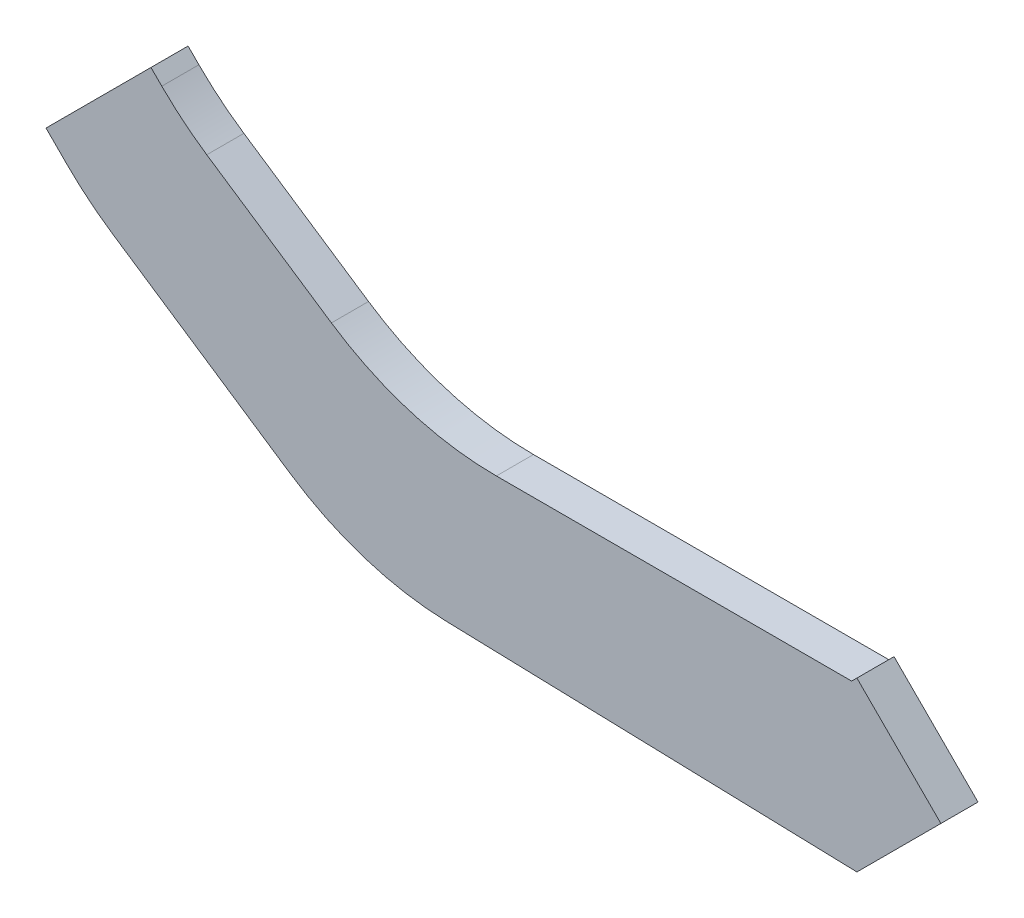
ISO-10303-21;
HEADER;
FILE_DESCRIPTION(('STEP AP214'),'2;1');
FILE_NAME('part.step','',(''),(''),'','','');
FILE_SCHEMA(('AUTOMOTIVE_DESIGN { 1 0 10303 214 1 1 1 1 }'));
ENDSEC;
DATA;
#1=APPLICATION_CONTEXT('core data for automotive mechanical design processes');
#2=APPLICATION_PROTOCOL_DEFINITION('international standard','automotive_design',2000,#1);
#3=PRODUCT_CONTEXT('',#1,'mechanical');
#4=PRODUCT('Part','Part','',(#3));
#5=PRODUCT_RELATED_PRODUCT_CATEGORY('part','',(#4));
#6=PRODUCT_DEFINITION_FORMATION('','',#4);
#7=PRODUCT_DEFINITION_CONTEXT('part definition',#1,'design');
#8=PRODUCT_DEFINITION('design','',#6,#7);
#9=PRODUCT_DEFINITION_SHAPE('','',#8);
#10=(LENGTH_UNIT() NAMED_UNIT(*) SI_UNIT(.MILLI.,.METRE.));
#11=(NAMED_UNIT(*) PLANE_ANGLE_UNIT() SI_UNIT($,.RADIAN.));
#12=(NAMED_UNIT(*) SI_UNIT($,.STERADIAN.) SOLID_ANGLE_UNIT());
#13=UNCERTAINTY_MEASURE_WITH_UNIT(LENGTH_MEASURE(1.E-05),#10,'distance_accuracy_value','');
#14=(GEOMETRIC_REPRESENTATION_CONTEXT(3) GLOBAL_UNCERTAINTY_ASSIGNED_CONTEXT((#13)) GLOBAL_UNIT_ASSIGNED_CONTEXT((#10,
#11,#12)) REPRESENTATION_CONTEXT('',''));
#15=CARTESIAN_POINT('',(0.,0.,0.));
#16=DIRECTION('',(0.,0.,1.));
#17=DIRECTION('',(1.,0.,0.));
#18=AXIS2_PLACEMENT_3D('',#15,#16,#17);
#19=CARTESIAN_POINT('',(-2.22847660037592,-2.86269222416722,0.125));
#20=DIRECTION('',(0.555624968866409,0.831433036372865,0.));
#21=DIRECTION('',(-0.831433036372865,0.555624968866409,0.));
#22=AXIS2_PLACEMENT_3D('',#19,#20,#21);
#23=PLANE('',#22);
#24=DIRECTION('',(0.831433036372865,-0.555624968866409,0.));
#25=VECTOR('',#24,1.);
#26=CARTESIAN_POINT('',(-2.22847660037592,-2.86269222416722,0.125));
#27=LINE('',#26,#25);
#28=CARTESIAN_POINT('',(-2.06475385269638,-2.97210385757912,0.125));
#29=VERTEX_POINT('',#28);
#30=CARTESIAN_POINT('',(-0.865059489816402,-3.7738282465117,0.125));
#31=VERTEX_POINT('',#30);
#32=EDGE_CURVE('E146',#29,#31,#27,.T.);
#33=ORIENTED_EDGE('',*,*,#32,.F.);
#34=DIRECTION('',(0.,0.,-1.));
#35=VECTOR('',#34,1.);
#36=CARTESIAN_POINT('',(-2.06475385269638,-2.97210385757912,0.125));
#37=LINE('',#36,#35);
#38=CARTESIAN_POINT('',(-2.06475385269638,-2.97210385757912,-0.125));
#39=VERTEX_POINT('',#38);
#40=EDGE_CURVE('E215',#29,#39,#37,.T.);
#41=ORIENTED_EDGE('',*,*,#40,.T.);
#42=DIRECTION('',(0.831433036372865,-0.555624968866409,0.));
#43=VECTOR('',#42,1.);
#44=CARTESIAN_POINT('',(-2.22847660037592,-2.86269222416722,-0.125));
#45=LINE('',#44,#43);
#46=CARTESIAN_POINT('',(-0.865059489816402,-3.7738282465117,-0.125));
#47=VERTEX_POINT('',#46);
#48=EDGE_CURVE('E180',#39,#47,#45,.T.);
#49=ORIENTED_EDGE('',*,*,#48,.T.);
#50=DIRECTION('',(0.,0.,-1.));
#51=VECTOR('',#50,1.);
#52=CARTESIAN_POINT('',(-0.865059489816401,-3.7738282465117,0.125));
#53=LINE('',#52,#51);
#54=EDGE_CURVE('E155',#47,#31,#53,.F.);
#55=ORIENTED_EDGE('',*,*,#54,.T.);
#56=EDGE_LOOP('',(#33,#41,#49,#55));
#57=FACE_BOUND('',#56,.T.);
#58=ADVANCED_FACE('F33',(#57),#23,.F.);
#59=CARTESIAN_POINT('',(-0.386567156307454,-4.09359216769115,0.125));
#60=DIRECTION('',(0.0287461408499354,0.999586744302982,0.));
#61=DIRECTION('',(-0.999586744302982,0.0287461408499354,0.));
#62=AXIS2_PLACEMENT_3D('',#59,#60,#61);
#63=PLANE('',#62);
#64=DIRECTION('',(0.999586744302982,-0.0287461408499354,0.));
#65=VECTOR('',#64,1.);
#66=CARTESIAN_POINT('',(-0.386567156307454,-4.09359216769115,0.125));
#67=LINE('',#66,#65);
#68=CARTESIAN_POINT('',(0.188698166216546,-4.11013566237193,0.125));
#69=VERTEX_POINT('',#68);
#70=CARTESIAN_POINT('',(2.95217081145383,-4.1896076785303,0.125));
#71=VERTEX_POINT('',#70);
#72=EDGE_CURVE('E133',#69,#71,#67,.T.);
#73=ORIENTED_EDGE('',*,*,#72,.F.);
#74=DIRECTION('',(0.,0.,-1.));
#75=VECTOR('',#74,1.);
#76=CARTESIAN_POINT('',(0.188698166216546,-4.11013566237193,0.125));
#77=LINE('',#76,#75);
#78=CARTESIAN_POINT('',(0.188698166216546,-4.11013566237193,-0.125));
#79=VERTEX_POINT('',#78);
#80=EDGE_CURVE('E227',#69,#79,#77,.T.);
#81=ORIENTED_EDGE('',*,*,#80,.T.);
#82=DIRECTION('',(0.999586744302982,-0.0287461408499354,0.));
#83=VECTOR('',#82,1.);
#84=CARTESIAN_POINT('',(-0.386567156307454,-4.09359216769115,-0.125));
#85=LINE('',#84,#83);
#86=CARTESIAN_POINT('',(2.95217081145383,-4.1896076785303,-0.125));
#87=VERTEX_POINT('',#86);
#88=EDGE_CURVE('E152',#79,#87,#85,.T.);
#89=ORIENTED_EDGE('',*,*,#88,.T.);
#90=DIRECTION('',(0.,0.,-1.));
#91=VECTOR('',#90,1.);
#92=CARTESIAN_POINT('',(2.95217081145383,-4.1896076785303,0.125));
#93=LINE('',#92,#91);
#94=EDGE_CURVE('E149',#71,#87,#93,.T.);
#95=ORIENTED_EDGE('',*,*,#94,.F.);
#96=EDGE_LOOP('',(#73,#81,#89,#95));
#97=FACE_BOUND('',#96,.T.);
#98=ADVANCED_FACE('F150',(#97),#63,.F.);
#99=CARTESIAN_POINT('',(3.51785623640307,-3.62392225358106,0.125));
#100=DIRECTION('',(-0.707106781186546,0.707106781186549,0.));
#101=DIRECTION('',(-0.707106781186549,-0.707106781186546,0.));
#102=AXIS2_PLACEMENT_3D('',#99,#100,#101);
#103=PLANE('',#102);
#104=DIRECTION('',(0.707106781186548,0.707106781186546,0.));
#105=VECTOR('',#104,1.);
#106=CARTESIAN_POINT('',(3.51785623640307,-3.62392225358106,-0.125));
#107=LINE('',#106,#105);
#108=CARTESIAN_POINT('',(3.51785623640307,-3.62392225358106,-0.125));
#109=VERTEX_POINT('',#108);
#110=EDGE_CURVE('E184',#87,#109,#107,.T.);
#111=ORIENTED_EDGE('',*,*,#110,.T.);
#112=DIRECTION('',(0.,0.,-1.));
#113=VECTOR('',#112,1.);
#114=CARTESIAN_POINT('',(3.51785623640307,-3.62392225358106,0.125));
#115=LINE('',#114,#113);
#116=CARTESIAN_POINT('',(3.51785623640307,-3.62392225358106,0.125));
#117=VERTEX_POINT('',#116);
#118=EDGE_CURVE('E156',#117,#109,#115,.T.);
#119=ORIENTED_EDGE('',*,*,#118,.F.);
#120=DIRECTION('',(0.707106781186548,0.707106781186546,0.));
#121=VECTOR('',#120,1.);
#122=CARTESIAN_POINT('',(3.51785623640307,-3.62392225358106,0.125));
#123=LINE('',#122,#121);
#124=EDGE_CURVE('E138',#71,#117,#123,.T.);
#125=ORIENTED_EDGE('',*,*,#124,.F.);
#126=ORIENTED_EDGE('',*,*,#94,.T.);
#127=EDGE_LOOP('',(#111,#119,#125,#126));
#128=FACE_BOUND('',#127,.T.);
#129=ADVANCED_FACE('F158',(#128),#103,.F.);
#130=CARTESIAN_POINT('',(2.95217081145383,-3.05823682863182,0.125));
#131=DIRECTION('',(-0.707106781186549,-0.707106781186546,0.));
#132=DIRECTION('',(0.707106781186546,-0.707106781186549,0.));
#133=AXIS2_PLACEMENT_3D('',#130,#131,#132);
#134=PLANE('',#133);
#135=DIRECTION('',(-0.707106781186546,0.707106781186548,0.));
#136=VECTOR('',#135,1.);
#137=CARTESIAN_POINT('',(2.95217081145383,-3.05823682863182,-0.125));
#138=LINE('',#137,#136);
#139=CARTESIAN_POINT('',(2.95217081145383,-3.05823682863182,-0.125));
#140=VERTEX_POINT('',#139);
#141=EDGE_CURVE('E186',#109,#140,#138,.T.);
#142=ORIENTED_EDGE('',*,*,#141,.T.);
#143=DIRECTION('',(0.,0.,-1.));
#144=VECTOR('',#143,1.);
#145=CARTESIAN_POINT('',(2.95217081145383,-3.05823682863182,0.125));
#146=LINE('',#145,#144);
#147=CARTESIAN_POINT('',(2.95217081145383,-3.05823682863182,0.125));
#148=VERTEX_POINT('',#147);
#149=EDGE_CURVE('E210',#148,#140,#146,.T.);
#150=ORIENTED_EDGE('',*,*,#149,.F.);
#151=DIRECTION('',(-0.707106781186546,0.707106781186548,0.));
#152=VECTOR('',#151,1.);
#153=CARTESIAN_POINT('',(2.95217081145383,-3.05823682863182,0.125));
#154=LINE('',#153,#152);
#155=EDGE_CURVE('E161',#117,#148,#154,.T.);
#156=ORIENTED_EDGE('',*,*,#155,.F.);
#157=ORIENTED_EDGE('',*,*,#118,.T.);
#158=EDGE_LOOP('',(#142,#150,#156,#157));
#159=FACE_BOUND('',#158,.T.);
#160=ADVANCED_FACE('F297',(#159),#134,.F.);
#161=CARTESIAN_POINT('',(2.95217081145383,-3.05823682863182,0.125));
#162=DIRECTION('',(0.707106781186543,-0.707106781186552,0.));
#163=DIRECTION('',(0.707106781186552,0.707106781186543,0.));
#164=AXIS2_PLACEMENT_3D('',#161,#162,#163);
#165=PLANE('',#164);
#166=DIRECTION('',(-0.707106781186552,-0.707106781186543,0.));
#167=VECTOR('',#166,1.);
#168=CARTESIAN_POINT('',(2.95217081145383,-3.05823682863182,-0.125));
#169=LINE('',#168,#167);
#170=CARTESIAN_POINT('',(2.9168154723945,-3.09359216769115,-0.125));
#171=VERTEX_POINT('',#170);
#172=EDGE_CURVE('E188',#140,#171,#169,.T.);
#173=ORIENTED_EDGE('',*,*,#172,.T.);
#174=DIRECTION('',(0.,0.,-1.));
#175=VECTOR('',#174,1.);
#176=CARTESIAN_POINT('',(2.9168154723945,-3.09359216769115,0.125));
#177=LINE('',#176,#175);
#178=CARTESIAN_POINT('',(2.9168154723945,-3.09359216769115,0.125));
#179=VERTEX_POINT('',#178);
#180=EDGE_CURVE('E207',#179,#171,#177,.T.);
#181=ORIENTED_EDGE('',*,*,#180,.F.);
#182=DIRECTION('',(-0.707106781186552,-0.707106781186543,0.));
#183=VECTOR('',#182,1.);
#184=CARTESIAN_POINT('',(2.95217081145383,-3.05823682863182,0.125));
#185=LINE('',#184,#183);
#186=EDGE_CURVE('E163',#148,#179,#185,.T.);
#187=ORIENTED_EDGE('',*,*,#186,.F.);
#188=ORIENTED_EDGE('',*,*,#149,.T.);
#189=EDGE_LOOP('',(#173,#181,#187,#188));
#190=FACE_BOUND('',#189,.T.);
#191=ADVANCED_FACE('F300',(#190),#165,.F.);
#192=CARTESIAN_POINT('',(2.9168154723945,-3.09359216769115,0.125));
#193=DIRECTION('',(0.,-1.,0.));
#194=DIRECTION('',(1.,0.,0.));
#195=AXIS2_PLACEMENT_3D('',#192,#193,#194);
#196=PLANE('',#195);
#197=DIRECTION('',(-1.,0.,0.));
#198=VECTOR('',#197,1.);
#199=CARTESIAN_POINT('',(2.9168154723945,-3.09359216769115,-0.125));
#200=LINE('',#199,#198);
#201=CARTESIAN_POINT('',(0.52358072979842,-3.09359216769115,-0.125));
#202=VERTEX_POINT('',#201);
#203=EDGE_CURVE('E190',#171,#202,#200,.T.);
#204=ORIENTED_EDGE('',*,*,#203,.T.);
#205=DIRECTION('',(0.,0.,-1.));
#206=VECTOR('',#205,1.);
#207=CARTESIAN_POINT('',(0.52358072979842,-3.09359216769115,0.125));
#208=LINE('',#207,#206);
#209=CARTESIAN_POINT('',(0.52358072979842,-3.09359216769115,0.125));
#210=VERTEX_POINT('',#209);
#211=EDGE_CURVE('E236',#202,#210,#208,.F.);
#212=ORIENTED_EDGE('',*,*,#211,.T.);
#213=DIRECTION('',(-1.,0.,0.));
#214=VECTOR('',#213,1.);
#215=CARTESIAN_POINT('',(2.9168154723945,-3.09359216769115,0.125));
#216=LINE('',#215,#214);
#217=EDGE_CURVE('E168',#179,#210,#216,.T.);
#218=ORIENTED_EDGE('',*,*,#217,.F.);
#219=ORIENTED_EDGE('',*,*,#180,.T.);
#220=EDGE_LOOP('',(#204,#212,#218,#219));
#221=FACE_BOUND('',#220,.T.);
#222=ADVANCED_FACE('F250',(#221),#196,.F.);
#223=CARTESIAN_POINT('',(-1.59099025766974,-2.08596500450031,0.125));
#224=DIRECTION('',(-0.555624968866409,-0.831433036372865,0.));
#225=DIRECTION('',(0.831433036372865,-0.555624968866409,0.));
#226=AXIS2_PLACEMENT_3D('',#223,#224,#225);
#227=PLANE('',#226);
#228=DIRECTION('',(-0.831433036372865,0.555624968866409,0.));
#229=VECTOR('',#228,1.);
#230=CARTESIAN_POINT('',(-1.59099025766974,-2.08596500450031,-0.125));
#231=LINE('',#230,#229);
#232=CARTESIAN_POINT('',(-0.587669207934397,-2.75645824043688,-0.125));
#233=VERTEX_POINT('',#232);
#234=CARTESIAN_POINT('',(-1.4272675099902,-2.1953766379122,-0.125));
#235=VERTEX_POINT('',#234);
#236=EDGE_CURVE('E193',#233,#235,#231,.T.);
#237=ORIENTED_EDGE('',*,*,#236,.T.);
#238=DIRECTION('',(0.,0.,-1.));
#239=VECTOR('',#238,1.);
#240=CARTESIAN_POINT('',(-1.4272675099902,-2.1953766379122,0.125));
#241=LINE('',#240,#239);
#242=CARTESIAN_POINT('',(-1.4272675099902,-2.1953766379122,0.125));
#243=VERTEX_POINT('',#242);
#244=EDGE_CURVE('E56',#235,#243,#241,.F.);
#245=ORIENTED_EDGE('',*,*,#244,.T.);
#246=DIRECTION('',(-0.831433036372865,0.555624968866409,0.));
#247=VECTOR('',#246,1.);
#248=CARTESIAN_POINT('',(-1.59099025766974,-2.08596500450031,0.125));
#249=LINE('',#248,#247);
#250=CARTESIAN_POINT('',(-0.587669207934397,-2.75645824043688,0.125));
#251=VERTEX_POINT('',#250);
#252=EDGE_CURVE('E171',#251,#243,#249,.T.);
#253=ORIENTED_EDGE('',*,*,#252,.F.);
#254=DIRECTION('',(0.,0.,-1.));
#255=VECTOR('',#254,1.);
#256=CARTESIAN_POINT('',(-0.587669207934398,-2.75645824043688,-0.125));
#257=LINE('',#256,#255);
#258=EDGE_CURVE('E232',#251,#233,#257,.T.);
#259=ORIENTED_EDGE('',*,*,#258,.T.);
#260=EDGE_LOOP('',(#237,#245,#253,#259));
#261=FACE_BOUND('',#260,.T.);
#262=ADVANCED_FACE('F254',(#261),#227,.F.);
#263=CARTESIAN_POINT('',(-1.80312229202571,-1.87383297014434,0.125));
#264=DIRECTION('',(-0.707106781186551,-0.707106781186544,0.));
#265=DIRECTION('',(0.707106781186544,-0.707106781186551,0.));
#266=AXIS2_PLACEMENT_3D('',#263,#264,#265);
#267=PLANE('',#266);
#268=DIRECTION('',(-0.707106781186544,0.707106781186552,0.));
#269=VECTOR('',#268,1.);
#270=CARTESIAN_POINT('',(-1.80312229202571,-1.87383297014434,0.125));
#271=LINE('',#270,#269);
#272=CARTESIAN_POINT('',(-1.73023113463049,-1.94672412753956,0.125));
#273=VERTEX_POINT('',#272);
#274=CARTESIAN_POINT('',(-1.80312229202571,-1.87383297014434,0.125));
#275=VERTEX_POINT('',#274);
#276=EDGE_CURVE('E173',#273,#275,#271,.T.);
#277=ORIENTED_EDGE('',*,*,#276,.F.);
#278=DIRECTION('',(0.,0.,-1.));
#279=VECTOR('',#278,1.);
#280=CARTESIAN_POINT('',(-1.73023113463049,-1.94672412753956,-0.125));
#281=LINE('',#280,#279);
#282=CARTESIAN_POINT('',(-1.73023113463049,-1.94672412753956,-0.125));
#283=VERTEX_POINT('',#282);
#284=EDGE_CURVE('E229',#273,#283,#281,.T.);
#285=ORIENTED_EDGE('',*,*,#284,.T.);
#286=DIRECTION('',(-0.707106781186544,0.707106781186552,0.));
#287=VECTOR('',#286,1.);
#288=CARTESIAN_POINT('',(-1.80312229202571,-1.87383297014434,-0.125));
#289=LINE('',#288,#287);
#290=CARTESIAN_POINT('',(-1.80312229202571,-1.87383297014434,-0.125));
#291=VERTEX_POINT('',#290);
#292=EDGE_CURVE('E195',#283,#291,#289,.T.);
#293=ORIENTED_EDGE('',*,*,#292,.T.);
#294=DIRECTION('',(0.,0.,-1.));
#295=VECTOR('',#294,1.);
#296=CARTESIAN_POINT('',(-1.80312229202571,-1.87383297014434,0.125));
#297=LINE('',#296,#295);
#298=EDGE_CURVE('E204',#275,#291,#297,.T.);
#299=ORIENTED_EDGE('',*,*,#298,.F.);
#300=EDGE_LOOP('',(#277,#285,#293,#299));
#301=FACE_BOUND('',#300,.T.);
#302=ADVANCED_FACE('F260',(#301),#267,.F.);
#303=CARTESIAN_POINT('',(-1.80312229202571,-1.87383297014434,0.125));
#304=DIRECTION('',(0.707106781186544,-0.707106781186551,0.));
#305=DIRECTION('',(0.707106781186551,0.707106781186544,0.));
#306=AXIS2_PLACEMENT_3D('',#303,#304,#305);
#307=PLANE('',#306);
#308=DIRECTION('',(-0.707106781186551,-0.707106781186544,0.));
#309=VECTOR('',#308,1.);
#310=CARTESIAN_POINT('',(-1.80312229202571,-1.87383297014434,-0.125));
#311=LINE('',#310,#309);
#312=CARTESIAN_POINT('',(-2.51022907321226,-2.58093975133089,-0.125));
#313=VERTEX_POINT('',#312);
#314=EDGE_CURVE('E197',#291,#313,#311,.T.);
#315=ORIENTED_EDGE('',*,*,#314,.T.);
#316=DIRECTION('',(0.,0.,-1.));
#317=VECTOR('',#316,1.);
#318=CARTESIAN_POINT('',(-2.51022907321226,-2.58093975133089,0.125));
#319=LINE('',#318,#317);
#320=CARTESIAN_POINT('',(-2.51022907321226,-2.58093975133089,0.125));
#321=VERTEX_POINT('',#320);
#322=EDGE_CURVE('E179',#321,#313,#319,.T.);
#323=ORIENTED_EDGE('',*,*,#322,.F.);
#324=DIRECTION('',(-0.707106781186551,-0.707106781186544,0.));
#325=VECTOR('',#324,1.);
#326=CARTESIAN_POINT('',(-1.80312229202571,-1.87383297014434,0.125));
#327=LINE('',#326,#325);
#328=EDGE_CURVE('E175',#275,#321,#327,.T.);
#329=ORIENTED_EDGE('',*,*,#328,.F.);
#330=ORIENTED_EDGE('',*,*,#298,.T.);
#331=EDGE_LOOP('',(#315,#323,#329,#330));
#332=FACE_BOUND('',#331,.T.);
#333=ADVANCED_FACE('F266',(#332),#307,.F.);
#334=CARTESIAN_POINT('',(-2.51022907321226,-2.58093975133089,0.125));
#335=DIRECTION('',(0.70710678118655,0.707106781186545,0.));
#336=DIRECTION('',(-0.707106781186545,0.70710678118655,0.));
#337=AXIS2_PLACEMENT_3D('',#334,#335,#336);
#338=PLANE('',#337);
#339=DIRECTION('',(0.707106781186545,-0.70710678118655,0.));
#340=VECTOR('',#339,1.);
#341=CARTESIAN_POINT('',(-2.51022907321226,-2.58093975133089,-0.125));
#342=LINE('',#341,#340);
#343=CARTESIAN_POINT('',(-2.36771747733667,-2.72345134720648,-0.125));
#344=VERTEX_POINT('',#343);
#345=EDGE_CURVE('E199',#313,#344,#342,.T.);
#346=ORIENTED_EDGE('',*,*,#345,.T.);
#347=DIRECTION('',(0.,0.,-1.));
#348=VECTOR('',#347,1.);
#349=CARTESIAN_POINT('',(-2.36771747733667,-2.72345134720648,0.125));
#350=LINE('',#349,#348);
#351=CARTESIAN_POINT('',(-2.36771747733667,-2.72345134720648,0.125));
#352=VERTEX_POINT('',#351);
#353=EDGE_CURVE('E222',#344,#352,#350,.F.);
#354=ORIENTED_EDGE('',*,*,#353,.T.);
#355=DIRECTION('',(0.707106781186545,-0.70710678118655,0.));
#356=VECTOR('',#355,1.);
#357=CARTESIAN_POINT('',(-2.51022907321226,-2.58093975133089,0.125));
#358=LINE('',#357,#356);
#359=EDGE_CURVE('E177',#321,#352,#358,.T.);
#360=ORIENTED_EDGE('',*,*,#359,.F.);
#361=ORIENTED_EDGE('',*,*,#322,.T.);
#362=EDGE_LOOP('',(#346,#354,#360,#361));
#363=FACE_BOUND('',#362,.T.);
#364=ADVANCED_FACE('F270',(#363),#338,.F.);
#365=CARTESIAN_POINT('',(0.,0.,0.125));
#366=DIRECTION('',(0.,0.,-1.));
#367=DIRECTION('',(-1.,0.,0.));
#368=AXIS2_PLACEMENT_3D('',#365,#366,#367);
#369=PLANE('',#368);
#370=ORIENTED_EDGE('',*,*,#359,.T.);
#371=CARTESIAN_POINT('',(-0.953503914963566,-1.30923778483339,0.125));
#372=DIRECTION('',(0.,0.,-1.));
#373=DIRECTION('',(-1.,0.,0.));
#374=AXIS2_PLACEMENT_3D('',#371,#372,#373);
#375=CIRCLE('',#374,2.);
#376=EDGE_CURVE('E225',#352,#29,#375,.F.);
#377=ORIENTED_EDGE('',*,*,#376,.T.);
#378=ORIENTED_EDGE('',*,*,#32,.T.);
#379=CARTESIAN_POINT('',(0.246190447916417,-2.11096217376597,0.125));
#380=DIRECTION('',(0.,0.,-1.));
#381=DIRECTION('',(-1.,0.,0.));
#382=AXIS2_PLACEMENT_3D('',#379,#380,#381);
#383=CIRCLE('',#382,2.);
#384=EDGE_CURVE('E142',#31,#69,#383,.F.);
#385=ORIENTED_EDGE('',*,*,#384,.T.);
#386=ORIENTED_EDGE('',*,*,#72,.T.);
#387=ORIENTED_EDGE('',*,*,#124,.T.);
#388=ORIENTED_EDGE('',*,*,#155,.T.);
#389=ORIENTED_EDGE('',*,*,#186,.T.);
#390=ORIENTED_EDGE('',*,*,#217,.T.);
#391=CARTESIAN_POINT('',(0.523580729798419,-1.09359216769115,0.125));
#392=DIRECTION('',(0.,0.,-1.));
#393=DIRECTION('',(-1.,0.,0.));
#394=AXIS2_PLACEMENT_3D('',#391,#392,#393);
#395=CIRCLE('',#394,2.);
#396=EDGE_CURVE('E11',#210,#251,#395,.T.);
#397=ORIENTED_EDGE('',*,*,#396,.T.);
#398=ORIENTED_EDGE('',*,*,#252,.T.);
#399=CARTESIAN_POINT('',(-0.316017572257386,-0.532510565166472,0.125));
#400=DIRECTION('',(0.,0.,-1.));
#401=DIRECTION('',(-1.,0.,0.));
#402=AXIS2_PLACEMENT_3D('',#399,#400,#401);
#403=CIRCLE('',#402,2.);
#404=EDGE_CURVE('E48',#243,#273,#403,.T.);
#405=ORIENTED_EDGE('',*,*,#404,.T.);
#406=ORIENTED_EDGE('',*,*,#276,.T.);
#407=ORIENTED_EDGE('',*,*,#328,.T.);
#408=EDGE_LOOP('',(#370,#377,#378,#385,#386,#387,#388,#389,#390,#397,#398,#405,#406,#407));
#409=FACE_BOUND('',#408,.T.);
#410=ADVANCED_FACE('F136',(#409),#369,.F.);
#411=CARTESIAN_POINT('',(0.,0.,-0.125));
#412=DIRECTION('',(0.,0.,-1.));
#413=DIRECTION('',(-1.,0.,0.));
#414=AXIS2_PLACEMENT_3D('',#411,#412,#413);
#415=PLANE('',#414);
#416=ORIENTED_EDGE('',*,*,#48,.F.);
#417=CARTESIAN_POINT('',(-0.953503914963566,-1.30923778483339,-0.125));
#418=DIRECTION('',(0.,0.,-1.));
#419=DIRECTION('',(-1.,0.,0.));
#420=AXIS2_PLACEMENT_3D('',#417,#418,#419);
#421=CIRCLE('',#420,2.);
#422=EDGE_CURVE('E220',#39,#344,#421,.T.);
#423=ORIENTED_EDGE('',*,*,#422,.T.);
#424=ORIENTED_EDGE('',*,*,#345,.F.);
#425=ORIENTED_EDGE('',*,*,#314,.F.);
#426=ORIENTED_EDGE('',*,*,#292,.F.);
#427=CARTESIAN_POINT('',(-0.316017572257386,-0.532510565166472,-0.125));
#428=DIRECTION('',(0.,0.,-1.));
#429=DIRECTION('',(-1.,0.,0.));
#430=AXIS2_PLACEMENT_3D('',#427,#428,#429);
#431=CIRCLE('',#430,2.);
#432=EDGE_CURVE('E238',#283,#235,#431,.F.);
#433=ORIENTED_EDGE('',*,*,#432,.T.);
#434=ORIENTED_EDGE('',*,*,#236,.F.);
#435=CARTESIAN_POINT('',(0.523580729798419,-1.09359216769115,-0.125));
#436=DIRECTION('',(0.,0.,-1.));
#437=DIRECTION('',(-1.,0.,0.));
#438=AXIS2_PLACEMENT_3D('',#435,#436,#437);
#439=CIRCLE('',#438,2.);
#440=EDGE_CURVE('E41',#233,#202,#439,.F.);
#441=ORIENTED_EDGE('',*,*,#440,.T.);
#442=ORIENTED_EDGE('',*,*,#203,.F.);
#443=ORIENTED_EDGE('',*,*,#172,.F.);
#444=ORIENTED_EDGE('',*,*,#141,.F.);
#445=ORIENTED_EDGE('',*,*,#110,.F.);
#446=ORIENTED_EDGE('',*,*,#88,.F.);
#447=CARTESIAN_POINT('',(0.246190447916417,-2.11096217376597,-0.125));
#448=DIRECTION('',(0.,0.,-1.));
#449=DIRECTION('',(-1.,0.,0.));
#450=AXIS2_PLACEMENT_3D('',#447,#448,#449);
#451=CIRCLE('',#450,2.);
#452=EDGE_CURVE('E218',#79,#47,#451,.T.);
#453=ORIENTED_EDGE('',*,*,#452,.T.);
#454=EDGE_LOOP('',(#416,#423,#424,#425,#426,#433,#434,#441,#442,#443,#444,#445,#446,#453));
#455=FACE_BOUND('',#454,.T.);
#456=ADVANCED_FACE('F244',(#455),#415,.T.);
#457=CARTESIAN_POINT('',(-0.953503914963566,-1.30923778483339,0.125));
#458=DIRECTION('',(0.,0.,-1.));
#459=DIRECTION('',(-1.,0.,0.));
#460=AXIS2_PLACEMENT_3D('',#457,#458,#459);
#461=CYLINDRICAL_SURFACE('',#460,2.);
#462=ORIENTED_EDGE('',*,*,#376,.F.);
#463=ORIENTED_EDGE('',*,*,#353,.F.);
#464=ORIENTED_EDGE('',*,*,#422,.F.);
#465=ORIENTED_EDGE('',*,*,#40,.F.);
#466=EDGE_LOOP('',(#462,#463,#464,#465));
#467=FACE_BOUND('',#466,.T.);
#468=ADVANCED_FACE('F276',(#467),#461,.T.);
#469=CARTESIAN_POINT('',(0.246190447916417,-2.11096217376597,0.125));
#470=DIRECTION('',(0.,0.,-1.));
#471=DIRECTION('',(-1.,0.,0.));
#472=AXIS2_PLACEMENT_3D('',#469,#470,#471);
#473=CYLINDRICAL_SURFACE('',#472,2.);
#474=ORIENTED_EDGE('',*,*,#384,.F.);
#475=ORIENTED_EDGE('',*,*,#54,.F.);
#476=ORIENTED_EDGE('',*,*,#452,.F.);
#477=ORIENTED_EDGE('',*,*,#80,.F.);
#478=EDGE_LOOP('',(#474,#475,#476,#477));
#479=FACE_BOUND('',#478,.T.);
#480=ADVANCED_FACE('F280',(#479),#473,.T.);
#481=CARTESIAN_POINT('',(-0.316017572257386,-0.532510565166472,0.125));
#482=DIRECTION('',(0.,0.,1.));
#483=DIRECTION('',(1.,0.,0.));
#484=AXIS2_PLACEMENT_3D('',#481,#482,#483);
#485=CYLINDRICAL_SURFACE('',#484,2.);
#486=ORIENTED_EDGE('',*,*,#404,.F.);
#487=ORIENTED_EDGE('',*,*,#244,.F.);
#488=ORIENTED_EDGE('',*,*,#432,.F.);
#489=ORIENTED_EDGE('',*,*,#284,.F.);
#490=EDGE_LOOP('',(#486,#487,#488,#489));
#491=FACE_BOUND('',#490,.T.);
#492=ADVANCED_FACE('F256',(#491),#485,.F.);
#493=CARTESIAN_POINT('',(0.523580729798419,-1.09359216769115,0.125));
#494=DIRECTION('',(0.,0.,1.));
#495=DIRECTION('',(1.,0.,0.));
#496=AXIS2_PLACEMENT_3D('',#493,#494,#495);
#497=CYLINDRICAL_SURFACE('',#496,2.);
#498=ORIENTED_EDGE('',*,*,#396,.F.);
#499=ORIENTED_EDGE('',*,*,#211,.F.);
#500=ORIENTED_EDGE('',*,*,#440,.F.);
#501=ORIENTED_EDGE('',*,*,#258,.F.);
#502=EDGE_LOOP('',(#498,#499,#500,#501));
#503=FACE_BOUND('',#502,.T.);
#504=ADVANCED_FACE('F35',(#503),#497,.F.);
#505=CLOSED_SHELL('',(#58,#98,#129,#160,#191,#222,#262,#302,#333,#364,#410,#456,#468,#480,#492,#504));
#506=MANIFOLD_SOLID_BREP('B2',#505);
#507=ADVANCED_BREP_SHAPE_REPRESENTATION('',(#18,#506),#14);
#508=SHAPE_DEFINITION_REPRESENTATION(#9,#507);
ENDSEC;
END-ISO-10303-21;
